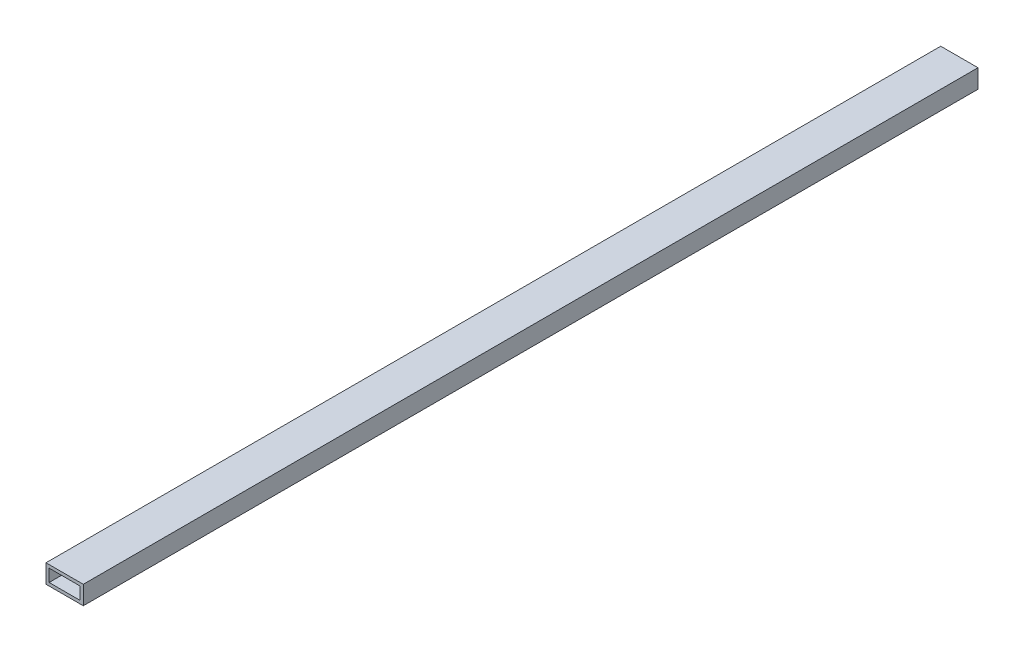
ISO-10303-21;
HEADER;
FILE_DESCRIPTION(('STEP AP214'),'2;1');
FILE_NAME('part.step','',(''),(''),'','','');
FILE_SCHEMA(('AUTOMOTIVE_DESIGN { 1 0 10303 214 1 1 1 1 }'));
ENDSEC;
DATA;
#1=APPLICATION_CONTEXT('core data for automotive mechanical design processes');
#2=APPLICATION_PROTOCOL_DEFINITION('international standard','automotive_design',2000,#1);
#3=PRODUCT_CONTEXT('',#1,'mechanical');
#4=PRODUCT('Part','Part','',(#3));
#5=PRODUCT_RELATED_PRODUCT_CATEGORY('part','',(#4));
#6=PRODUCT_DEFINITION_FORMATION('','',#4);
#7=PRODUCT_DEFINITION_CONTEXT('part definition',#1,'design');
#8=PRODUCT_DEFINITION('design','',#6,#7);
#9=PRODUCT_DEFINITION_SHAPE('','',#8);
#10=(LENGTH_UNIT() NAMED_UNIT(*) SI_UNIT(.MILLI.,.METRE.));
#11=(NAMED_UNIT(*) PLANE_ANGLE_UNIT() SI_UNIT($,.RADIAN.));
#12=(NAMED_UNIT(*) SI_UNIT($,.STERADIAN.) SOLID_ANGLE_UNIT());
#13=UNCERTAINTY_MEASURE_WITH_UNIT(LENGTH_MEASURE(1.E-05),#10,'distance_accuracy_value','');
#14=(GEOMETRIC_REPRESENTATION_CONTEXT(3) GLOBAL_UNCERTAINTY_ASSIGNED_CONTEXT((#13)) GLOBAL_UNIT_ASSIGNED_CONTEXT((#10,
#11,#12)) REPRESENTATION_CONTEXT('',''));
#15=CARTESIAN_POINT('',(0.,0.,0.));
#16=DIRECTION('',(0.,0.,1.));
#17=DIRECTION('',(1.,0.,0.));
#18=AXIS2_PLACEMENT_3D('',#15,#16,#17);
#19=CARTESIAN_POINT('',(0.,0.,457.2));
#20=DIRECTION('',(0.,0.,1.));
#21=DIRECTION('',(1.,0.,0.));
#22=AXIS2_PLACEMENT_3D('',#19,#20,#21);
#23=PLANE('',#22);
#24=DIRECTION('',(0.,-1.,0.));
#25=VECTOR('',#24,1.);
#26=CARTESIAN_POINT('',(-19.05,9.525,457.2));
#27=LINE('',#26,#25);
#28=CARTESIAN_POINT('',(-19.05,9.525,457.2));
#29=VERTEX_POINT('',#28);
#30=CARTESIAN_POINT('',(-19.05,-9.525,457.2));
#31=VERTEX_POINT('',#30);
#32=EDGE_CURVE('E119',#29,#31,#27,.T.);
#33=ORIENTED_EDGE('',*,*,#32,.T.);
#34=DIRECTION('',(1.,0.,0.));
#35=VECTOR('',#34,1.);
#36=CARTESIAN_POINT('',(-19.05,-9.525,457.2));
#37=LINE('',#36,#35);
#38=CARTESIAN_POINT('',(19.05,-9.525,457.2));
#39=VERTEX_POINT('',#38);
#40=EDGE_CURVE('E178',#31,#39,#37,.T.);
#41=ORIENTED_EDGE('',*,*,#40,.T.);
#42=DIRECTION('',(0.,1.,0.));
#43=VECTOR('',#42,1.);
#44=CARTESIAN_POINT('',(19.05,-9.525,457.2));
#45=LINE('',#44,#43);
#46=CARTESIAN_POINT('',(19.05,9.525,457.2));
#47=VERTEX_POINT('',#46);
#48=EDGE_CURVE('E181',#39,#47,#45,.T.);
#49=ORIENTED_EDGE('',*,*,#48,.T.);
#50=DIRECTION('',(-1.,0.,0.));
#51=VECTOR('',#50,1.);
#52=CARTESIAN_POINT('',(19.05,9.525,457.2));
#53=LINE('',#52,#51);
#54=EDGE_CURVE('E65',#47,#29,#53,.T.);
#55=ORIENTED_EDGE('',*,*,#54,.T.);
#56=EDGE_LOOP('',(#33,#41,#49,#55));
#57=FACE_BOUND('',#56,.T.);
#58=DIRECTION('',(1.,0.,0.));
#59=VECTOR('',#58,1.);
#60=CARTESIAN_POINT('',(-15.875,-6.35,457.2));
#61=LINE('',#60,#59);
#62=CARTESIAN_POINT('',(-15.875,-6.35,457.2));
#63=VERTEX_POINT('',#62);
#64=CARTESIAN_POINT('',(15.875,-6.35,457.2));
#65=VERTEX_POINT('',#64);
#66=EDGE_CURVE('E160',#63,#65,#61,.T.);
#67=ORIENTED_EDGE('',*,*,#66,.F.);
#68=DIRECTION('',(0.,-1.,0.));
#69=VECTOR('',#68,1.);
#70=CARTESIAN_POINT('',(-15.875,6.35,457.2));
#71=LINE('',#70,#69);
#72=CARTESIAN_POINT('',(-15.875,6.35,457.2));
#73=VERTEX_POINT('',#72);
#74=EDGE_CURVE('E115',#73,#63,#71,.T.);
#75=ORIENTED_EDGE('',*,*,#74,.F.);
#76=DIRECTION('',(-1.,0.,0.));
#77=VECTOR('',#76,1.);
#78=CARTESIAN_POINT('',(15.875,6.35,457.2));
#79=LINE('',#78,#77);
#80=CARTESIAN_POINT('',(15.875,6.35,457.2));
#81=VERTEX_POINT('',#80);
#82=EDGE_CURVE('E166',#81,#73,#79,.T.);
#83=ORIENTED_EDGE('',*,*,#82,.F.);
#84=DIRECTION('',(0.,1.,0.));
#85=VECTOR('',#84,1.);
#86=CARTESIAN_POINT('',(15.875,-6.35,457.2));
#87=LINE('',#86,#85);
#88=EDGE_CURVE('E163',#65,#81,#87,.T.);
#89=ORIENTED_EDGE('',*,*,#88,.F.);
#90=EDGE_LOOP('',(#67,#75,#83,#89));
#91=FACE_BOUND('',#90,.T.);
#92=ADVANCED_FACE('F41',(#57,#91),#23,.T.);
#93=CARTESIAN_POINT('',(-19.05,9.525,457.2));
#94=DIRECTION('',(1.,0.,0.));
#95=DIRECTION('',(0.,0.,-1.));
#96=AXIS2_PLACEMENT_3D('',#93,#94,#95);
#97=PLANE('',#96);
#98=DIRECTION('',(0.,0.,-1.));
#99=VECTOR('',#98,1.);
#100=CARTESIAN_POINT('',(-19.05,9.525,457.2));
#101=LINE('',#100,#99);
#102=CARTESIAN_POINT('',(-19.05,9.525,-457.2));
#103=VERTEX_POINT('',#102);
#104=EDGE_CURVE('E186',#29,#103,#101,.T.);
#105=ORIENTED_EDGE('',*,*,#104,.T.);
#106=DIRECTION('',(0.,-1.,0.));
#107=VECTOR('',#106,1.);
#108=CARTESIAN_POINT('',(-19.05,9.525,-457.2));
#109=LINE('',#108,#107);
#110=CARTESIAN_POINT('',(-19.05,-9.525,-457.2));
#111=VERTEX_POINT('',#110);
#112=EDGE_CURVE('E142',#103,#111,#109,.T.);
#113=ORIENTED_EDGE('',*,*,#112,.T.);
#114=DIRECTION('',(0.,0.,-1.));
#115=VECTOR('',#114,1.);
#116=CARTESIAN_POINT('',(-19.05,-9.525,457.2));
#117=LINE('',#116,#115);
#118=EDGE_CURVE('E11',#31,#111,#117,.T.);
#119=ORIENTED_EDGE('',*,*,#118,.F.);
#120=ORIENTED_EDGE('',*,*,#32,.F.);
#121=EDGE_LOOP('',(#105,#113,#119,#120));
#122=FACE_BOUND('',#121,.T.);
#123=ADVANCED_FACE('F43',(#122),#97,.F.);
#124=CARTESIAN_POINT('',(-19.05,-9.525,457.2));
#125=DIRECTION('',(0.,1.,0.));
#126=DIRECTION('',(-1.,0.,0.));
#127=AXIS2_PLACEMENT_3D('',#124,#125,#126);
#128=PLANE('',#127);
#129=ORIENTED_EDGE('',*,*,#118,.T.);
#130=DIRECTION('',(1.,0.,0.));
#131=VECTOR('',#130,1.);
#132=CARTESIAN_POINT('',(-19.05,-9.525,-457.2));
#133=LINE('',#132,#131);
#134=CARTESIAN_POINT('',(19.05,-9.525,-457.2));
#135=VERTEX_POINT('',#134);
#136=EDGE_CURVE('E146',#111,#135,#133,.T.);
#137=ORIENTED_EDGE('',*,*,#136,.T.);
#138=DIRECTION('',(0.,0.,-1.));
#139=VECTOR('',#138,1.);
#140=CARTESIAN_POINT('',(19.05,-9.525,457.2));
#141=LINE('',#140,#139);
#142=EDGE_CURVE('E50',#39,#135,#141,.T.);
#143=ORIENTED_EDGE('',*,*,#142,.F.);
#144=ORIENTED_EDGE('',*,*,#40,.F.);
#145=EDGE_LOOP('',(#129,#137,#143,#144));
#146=FACE_BOUND('',#145,.T.);
#147=ADVANCED_FACE('F202',(#146),#128,.F.);
#148=CARTESIAN_POINT('',(19.05,-9.525,457.2));
#149=DIRECTION('',(-1.,0.,0.));
#150=DIRECTION('',(0.,-1.,0.));
#151=AXIS2_PLACEMENT_3D('',#148,#149,#150);
#152=PLANE('',#151);
#153=ORIENTED_EDGE('',*,*,#142,.T.);
#154=DIRECTION('',(0.,1.,0.));
#155=VECTOR('',#154,1.);
#156=CARTESIAN_POINT('',(19.05,-9.525,-457.2));
#157=LINE('',#156,#155);
#158=CARTESIAN_POINT('',(19.05,9.525,-457.2));
#159=VERTEX_POINT('',#158);
#160=EDGE_CURVE('E150',#135,#159,#157,.T.);
#161=ORIENTED_EDGE('',*,*,#160,.T.);
#162=DIRECTION('',(0.,0.,-1.));
#163=VECTOR('',#162,1.);
#164=CARTESIAN_POINT('',(19.05,9.525,457.2));
#165=LINE('',#164,#163);
#166=EDGE_CURVE('E189',#47,#159,#165,.T.);
#167=ORIENTED_EDGE('',*,*,#166,.F.);
#168=ORIENTED_EDGE('',*,*,#48,.F.);
#169=EDGE_LOOP('',(#153,#161,#167,#168));
#170=FACE_BOUND('',#169,.T.);
#171=ADVANCED_FACE('F196',(#170),#152,.F.);
#172=CARTESIAN_POINT('',(19.05,9.525,457.2));
#173=DIRECTION('',(0.,-1.,0.));
#174=DIRECTION('',(1.,0.,0.));
#175=AXIS2_PLACEMENT_3D('',#172,#173,#174);
#176=PLANE('',#175);
#177=ORIENTED_EDGE('',*,*,#166,.T.);
#178=DIRECTION('',(-1.,0.,0.));
#179=VECTOR('',#178,1.);
#180=CARTESIAN_POINT('',(19.05,9.525,-457.2));
#181=LINE('',#180,#179);
#182=EDGE_CURVE('E154',#159,#103,#181,.T.);
#183=ORIENTED_EDGE('',*,*,#182,.T.);
#184=ORIENTED_EDGE('',*,*,#104,.F.);
#185=ORIENTED_EDGE('',*,*,#54,.F.);
#186=EDGE_LOOP('',(#177,#183,#184,#185));
#187=FACE_BOUND('',#186,.T.);
#188=ADVANCED_FACE('F207',(#187),#176,.F.);
#189=CARTESIAN_POINT('',(-15.875,6.35,457.2));
#190=DIRECTION('',(1.,0.,0.));
#191=DIRECTION('',(0.,1.,0.));
#192=AXIS2_PLACEMENT_3D('',#189,#190,#191);
#193=PLANE('',#192);
#194=DIRECTION('',(0.,0.,-1.));
#195=VECTOR('',#194,1.);
#196=CARTESIAN_POINT('',(-15.875,-6.35,457.2));
#197=LINE('',#196,#195);
#198=CARTESIAN_POINT('',(-15.875,-6.35,-457.2));
#199=VERTEX_POINT('',#198);
#200=EDGE_CURVE('E107',#63,#199,#197,.T.);
#201=ORIENTED_EDGE('',*,*,#200,.T.);
#202=DIRECTION('',(0.,-1.,0.));
#203=VECTOR('',#202,1.);
#204=CARTESIAN_POINT('',(-15.875,6.35,-457.2));
#205=LINE('',#204,#203);
#206=CARTESIAN_POINT('',(-15.875,6.35,-457.2));
#207=VERTEX_POINT('',#206);
#208=EDGE_CURVE('E112',#207,#199,#205,.T.);
#209=ORIENTED_EDGE('',*,*,#208,.F.);
#210=DIRECTION('',(0.,0.,-1.));
#211=VECTOR('',#210,1.);
#212=CARTESIAN_POINT('',(-15.875,6.35,457.2));
#213=LINE('',#212,#211);
#214=EDGE_CURVE('E169',#73,#207,#213,.T.);
#215=ORIENTED_EDGE('',*,*,#214,.F.);
#216=ORIENTED_EDGE('',*,*,#74,.T.);
#217=EDGE_LOOP('',(#201,#209,#215,#216));
#218=FACE_BOUND('',#217,.T.);
#219=ADVANCED_FACE('F109',(#218),#193,.T.);
#220=CARTESIAN_POINT('',(-15.875,-6.35,457.2));
#221=DIRECTION('',(0.,1.,0.));
#222=DIRECTION('',(-1.,0.,0.));
#223=AXIS2_PLACEMENT_3D('',#220,#221,#222);
#224=PLANE('',#223);
#225=DIRECTION('',(0.,0.,-1.));
#226=VECTOR('',#225,1.);
#227=CARTESIAN_POINT('',(15.875,-6.35,457.2));
#228=LINE('',#227,#226);
#229=CARTESIAN_POINT('',(15.875,-6.35,-457.2));
#230=VERTEX_POINT('',#229);
#231=EDGE_CURVE('E120',#65,#230,#228,.T.);
#232=ORIENTED_EDGE('',*,*,#231,.T.);
#233=DIRECTION('',(1.,0.,0.));
#234=VECTOR('',#233,1.);
#235=CARTESIAN_POINT('',(-15.875,-6.35,-457.2));
#236=LINE('',#235,#234);
#237=EDGE_CURVE('E123',#199,#230,#236,.T.);
#238=ORIENTED_EDGE('',*,*,#237,.F.);
#239=ORIENTED_EDGE('',*,*,#200,.F.);
#240=ORIENTED_EDGE('',*,*,#66,.T.);
#241=EDGE_LOOP('',(#232,#238,#239,#240));
#242=FACE_BOUND('',#241,.T.);
#243=ADVANCED_FACE('F124',(#242),#224,.T.);
#244=CARTESIAN_POINT('',(15.875,-6.35,457.2));
#245=DIRECTION('',(-1.,0.,0.));
#246=DIRECTION('',(0.,-1.,0.));
#247=AXIS2_PLACEMENT_3D('',#244,#245,#246);
#248=PLANE('',#247);
#249=DIRECTION('',(0.,0.,-1.));
#250=VECTOR('',#249,1.);
#251=CARTESIAN_POINT('',(15.875,6.35,457.2));
#252=LINE('',#251,#250);
#253=CARTESIAN_POINT('',(15.875,6.35,-457.2));
#254=VERTEX_POINT('',#253);
#255=EDGE_CURVE('E57',#81,#254,#252,.T.);
#256=ORIENTED_EDGE('',*,*,#255,.T.);
#257=DIRECTION('',(0.,1.,0.));
#258=VECTOR('',#257,1.);
#259=CARTESIAN_POINT('',(15.875,-6.35,-457.2));
#260=LINE('',#259,#258);
#261=EDGE_CURVE('E130',#230,#254,#260,.T.);
#262=ORIENTED_EDGE('',*,*,#261,.F.);
#263=ORIENTED_EDGE('',*,*,#231,.F.);
#264=ORIENTED_EDGE('',*,*,#88,.T.);
#265=EDGE_LOOP('',(#256,#262,#263,#264));
#266=FACE_BOUND('',#265,.T.);
#267=ADVANCED_FACE('F225',(#266),#248,.T.);
#268=CARTESIAN_POINT('',(15.875,6.35,457.2));
#269=DIRECTION('',(0.,-1.,0.));
#270=DIRECTION('',(0.,0.,-1.));
#271=AXIS2_PLACEMENT_3D('',#268,#269,#270);
#272=PLANE('',#271);
#273=ORIENTED_EDGE('',*,*,#214,.T.);
#274=DIRECTION('',(-1.,0.,0.));
#275=VECTOR('',#274,1.);
#276=CARTESIAN_POINT('',(15.875,6.35,-457.2));
#277=LINE('',#276,#275);
#278=EDGE_CURVE('E134',#254,#207,#277,.T.);
#279=ORIENTED_EDGE('',*,*,#278,.F.);
#280=ORIENTED_EDGE('',*,*,#255,.F.);
#281=ORIENTED_EDGE('',*,*,#82,.T.);
#282=EDGE_LOOP('',(#273,#279,#280,#281));
#283=FACE_BOUND('',#282,.T.);
#284=ADVANCED_FACE('F228',(#283),#272,.T.);
#285=CARTESIAN_POINT('',(0.,0.,-457.2));
#286=DIRECTION('',(0.,0.,1.));
#287=DIRECTION('',(1.,0.,0.));
#288=AXIS2_PLACEMENT_3D('',#285,#286,#287);
#289=PLANE('',#288);
#290=ORIENTED_EDGE('',*,*,#278,.T.);
#291=ORIENTED_EDGE('',*,*,#208,.T.);
#292=ORIENTED_EDGE('',*,*,#237,.T.);
#293=ORIENTED_EDGE('',*,*,#261,.T.);
#294=EDGE_LOOP('',(#290,#291,#292,#293));
#295=FACE_BOUND('',#294,.T.);
#296=ORIENTED_EDGE('',*,*,#112,.F.);
#297=ORIENTED_EDGE('',*,*,#182,.F.);
#298=ORIENTED_EDGE('',*,*,#160,.F.);
#299=ORIENTED_EDGE('',*,*,#136,.F.);
#300=EDGE_LOOP('',(#296,#297,#298,#299));
#301=FACE_BOUND('',#300,.T.);
#302=ADVANCED_FACE('F132',(#295,#301),#289,.F.);
#303=CLOSED_SHELL('',(#92,#123,#147,#171,#188,#219,#243,#267,#284,#302));
#304=MANIFOLD_SOLID_BREP('B2',#303);
#305=ADVANCED_BREP_SHAPE_REPRESENTATION('',(#18,#304),#14);
#306=SHAPE_DEFINITION_REPRESENTATION(#9,#305);
ENDSEC;
END-ISO-10303-21;
